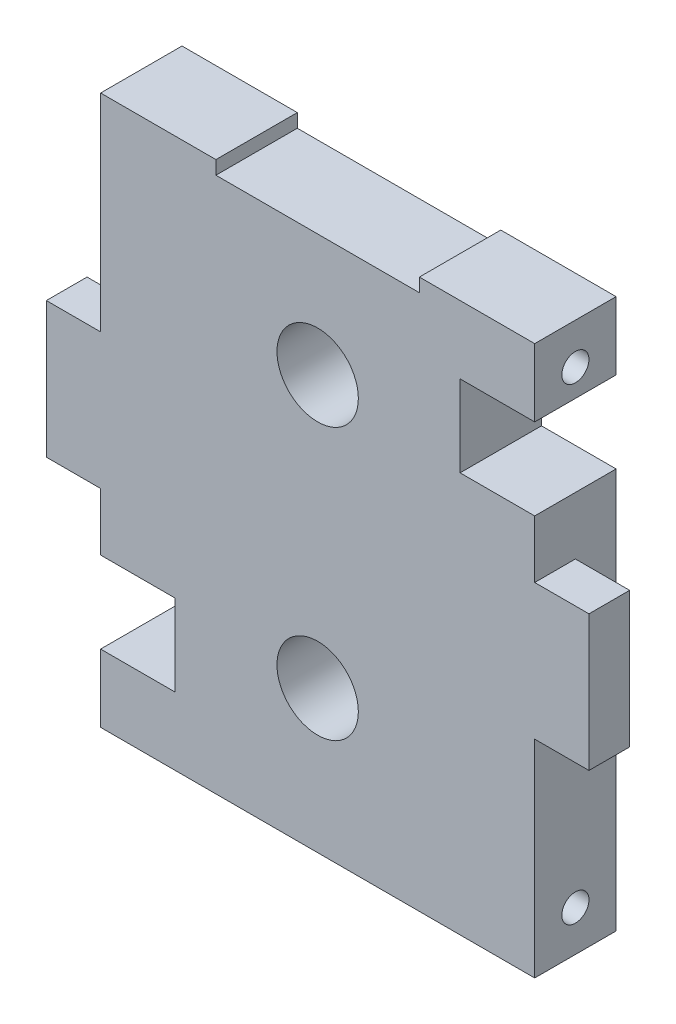
ISO-10303-21;
HEADER;
FILE_DESCRIPTION(('STEP AP214'),'2;1');
FILE_NAME('part.step','',(''),(''),'','','');
FILE_SCHEMA(('AUTOMOTIVE_DESIGN { 1 0 10303 214 1 1 1 1 }'));
ENDSEC;
DATA;
#1=APPLICATION_CONTEXT('core data for automotive mechanical design processes');
#2=APPLICATION_PROTOCOL_DEFINITION('international standard','automotive_design',2000,#1);
#3=PRODUCT_CONTEXT('',#1,'mechanical');
#4=PRODUCT('Part','Part','',(#3));
#5=PRODUCT_RELATED_PRODUCT_CATEGORY('part','',(#4));
#6=PRODUCT_DEFINITION_FORMATION('','',#4);
#7=PRODUCT_DEFINITION_CONTEXT('part definition',#1,'design');
#8=PRODUCT_DEFINITION('design','',#6,#7);
#9=PRODUCT_DEFINITION_SHAPE('','',#8);
#10=(LENGTH_UNIT() NAMED_UNIT(*) SI_UNIT(.MILLI.,.METRE.));
#11=(NAMED_UNIT(*) PLANE_ANGLE_UNIT() SI_UNIT($,.RADIAN.));
#12=(NAMED_UNIT(*) SI_UNIT($,.STERADIAN.) SOLID_ANGLE_UNIT());
#13=UNCERTAINTY_MEASURE_WITH_UNIT(LENGTH_MEASURE(1.E-05),#10,'distance_accuracy_value','');
#14=(GEOMETRIC_REPRESENTATION_CONTEXT(3) GLOBAL_UNCERTAINTY_ASSIGNED_CONTEXT((#13)) GLOBAL_UNIT_ASSIGNED_CONTEXT((#10,
#11,#12)) REPRESENTATION_CONTEXT('',''));
#15=CARTESIAN_POINT('',(0.,0.,0.));
#16=DIRECTION('',(0.,0.,1.));
#17=DIRECTION('',(1.,0.,0.));
#18=AXIS2_PLACEMENT_3D('',#15,#16,#17);
#19=CARTESIAN_POINT('',(32.,0.,3.));
#20=DIRECTION('',(0.,-1.,0.));
#21=DIRECTION('',(0.,0.,-1.));
#22=AXIS2_PLACEMENT_3D('',#19,#20,#21);
#23=PLANE('',#22);
#24=DIRECTION('',(-1.,0.,0.));
#25=VECTOR('',#24,1.);
#26=CARTESIAN_POINT('',(32.,0.,-3.));
#27=LINE('',#26,#25);
#28=CARTESIAN_POINT('',(32.,0.,-3.));
#29=VERTEX_POINT('',#28);
#30=CARTESIAN_POINT('',(23.5,0.,-3.));
#31=VERTEX_POINT('',#30);
#32=EDGE_CURVE('E301',#29,#31,#27,.T.);
#33=ORIENTED_EDGE('',*,*,#32,.T.);
#34=DIRECTION('',(0.,0.,1.));
#35=VECTOR('',#34,1.);
#36=CARTESIAN_POINT('',(23.5,0.,-7.));
#37=LINE('',#36,#35);
#38=CARTESIAN_POINT('',(23.5,0.,3.));
#39=VERTEX_POINT('',#38);
#40=EDGE_CURVE('E283',#31,#39,#37,.T.);
#41=ORIENTED_EDGE('',*,*,#40,.T.);
#42=DIRECTION('',(-1.,0.,0.));
#43=VECTOR('',#42,1.);
#44=CARTESIAN_POINT('',(32.,0.,3.));
#45=LINE('',#44,#43);
#46=CARTESIAN_POINT('',(32.,0.,3.));
#47=VERTEX_POINT('',#46);
#48=EDGE_CURVE('E344',#47,#39,#45,.T.);
#49=ORIENTED_EDGE('',*,*,#48,.F.);
#50=DIRECTION('',(0.,0.,-1.));
#51=VECTOR('',#50,1.);
#52=CARTESIAN_POINT('',(32.,0.,3.));
#53=LINE('',#52,#51);
#54=EDGE_CURVE('E177',#47,#29,#53,.T.);
#55=ORIENTED_EDGE('',*,*,#54,.T.);
#56=EDGE_LOOP('',(#33,#41,#49,#55));
#57=FACE_BOUND('',#56,.T.);
#58=ADVANCED_FACE('F41',(#57),#23,.F.);
#59=CARTESIAN_POINT('',(0.,0.,0.));
#60=DIRECTION('',(0.,0.,1.));
#61=DIRECTION('',(1.,0.,0.));
#62=AXIS2_PLACEMENT_3D('',#59,#60,#61);
#63=PLANE('',#62);
#64=DIRECTION('',(1.,0.,0.));
#65=VECTOR('',#64,1.);
#66=CARTESIAN_POINT('',(36.,-25.25,0.));
#67=LINE('',#66,#65);
#68=CARTESIAN_POINT('',(32.,-25.25,0.));
#69=VERTEX_POINT('',#68);
#70=CARTESIAN_POINT('',(36.,-25.25,0.));
#71=VERTEX_POINT('',#70);
#72=EDGE_CURVE('E189',#69,#71,#67,.T.);
#73=ORIENTED_EDGE('',*,*,#72,.F.);
#74=DIRECTION('',(0.,1.,0.));
#75=VECTOR('',#74,1.);
#76=CARTESIAN_POINT('',(32.,0.,0.));
#77=LINE('',#76,#75);
#78=CARTESIAN_POINT('',(32.,-15.25,0.));
#79=VERTEX_POINT('',#78);
#80=EDGE_CURVE('E333',#69,#79,#77,.T.);
#81=ORIENTED_EDGE('',*,*,#80,.T.);
#82=DIRECTION('',(-1.,0.,0.));
#83=VECTOR('',#82,1.);
#84=CARTESIAN_POINT('',(32.,-15.25,0.));
#85=LINE('',#84,#83);
#86=CARTESIAN_POINT('',(36.,-15.25,0.));
#87=VERTEX_POINT('',#86);
#88=EDGE_CURVE('E192',#87,#79,#85,.T.);
#89=ORIENTED_EDGE('',*,*,#88,.F.);
#90=DIRECTION('',(0.,1.,0.));
#91=VECTOR('',#90,1.);
#92=CARTESIAN_POINT('',(36.,-15.25,0.));
#93=LINE('',#92,#91);
#94=EDGE_CURVE('E87',#71,#87,#93,.T.);
#95=ORIENTED_EDGE('',*,*,#94,.F.);
#96=EDGE_LOOP('',(#73,#81,#89,#95));
#97=FACE_BOUND('',#96,.T.);
#98=ADVANCED_FACE('F486',(#97),#63,.F.);
#99=CARTESIAN_POINT('',(0.,0.,3.));
#100=DIRECTION('',(0.,0.,1.));
#101=DIRECTION('',(1.,0.,0.));
#102=AXIS2_PLACEMENT_3D('',#99,#100,#101);
#103=PLANE('',#102);
#104=DIRECTION('',(0.,1.,0.));
#105=VECTOR('',#104,1.);
#106=CARTESIAN_POINT('',(23.5,-1.,3.));
#107=LINE('',#106,#105);
#108=CARTESIAN_POINT('',(23.5,-1.,3.));
#109=VERTEX_POINT('',#108);
#110=EDGE_CURVE('E793',#109,#39,#107,.T.);
#111=ORIENTED_EDGE('',*,*,#110,.F.);
#112=DIRECTION('',(1.,0.,0.));
#113=VECTOR('',#112,1.);
#114=CARTESIAN_POINT('',(8.5,-1.,3.));
#115=LINE('',#114,#113);
#116=CARTESIAN_POINT('',(8.5,-1.,3.));
#117=VERTEX_POINT('',#116);
#118=EDGE_CURVE('E268',#117,#109,#115,.T.);
#119=ORIENTED_EDGE('',*,*,#118,.F.);
#120=DIRECTION('',(0.,-1.,0.));
#121=VECTOR('',#120,1.);
#122=CARTESIAN_POINT('',(8.5,-1.,3.));
#123=LINE('',#122,#121);
#124=CARTESIAN_POINT('',(8.5,0.,3.));
#125=VERTEX_POINT('',#124);
#126=EDGE_CURVE('E790',#125,#117,#123,.T.);
#127=ORIENTED_EDGE('',*,*,#126,.F.);
#128=CARTESIAN_POINT('',(0.,0.,3.));
#129=VERTEX_POINT('',#128);
#130=EDGE_CURVE('E95',#125,#129,#45,.T.);
#131=ORIENTED_EDGE('',*,*,#130,.T.);
#132=DIRECTION('',(0.,-1.,0.));
#133=VECTOR('',#132,1.);
#134=CARTESIAN_POINT('',(0.,0.,3.));
#135=LINE('',#134,#133);
#136=CARTESIAN_POINT('',(0.,-15.25,3.));
#137=VERTEX_POINT('',#136);
#138=EDGE_CURVE('E346',#129,#137,#135,.T.);
#139=ORIENTED_EDGE('',*,*,#138,.T.);
#140=DIRECTION('',(-1.,0.,0.));
#141=VECTOR('',#140,1.);
#142=CARTESIAN_POINT('',(0.,-15.25,3.));
#143=LINE('',#142,#141);
#144=CARTESIAN_POINT('',(-4.,-15.25,3.));
#145=VERTEX_POINT('',#144);
#146=EDGE_CURVE('E348',#137,#145,#143,.T.);
#147=ORIENTED_EDGE('',*,*,#146,.T.);
#148=DIRECTION('',(0.,-1.,0.));
#149=VECTOR('',#148,1.);
#150=CARTESIAN_POINT('',(-4.,-15.25,3.));
#151=LINE('',#150,#149);
#152=CARTESIAN_POINT('',(-4.,-25.25,3.));
#153=VERTEX_POINT('',#152);
#154=EDGE_CURVE('E350',#145,#153,#151,.T.);
#155=ORIENTED_EDGE('',*,*,#154,.T.);
#156=DIRECTION('',(1.,0.,0.));
#157=VECTOR('',#156,1.);
#158=CARTESIAN_POINT('',(-4.,-25.25,3.));
#159=LINE('',#158,#157);
#160=CARTESIAN_POINT('',(0.,-25.25,3.));
#161=VERTEX_POINT('',#160);
#162=EDGE_CURVE('E352',#153,#161,#159,.T.);
#163=ORIENTED_EDGE('',*,*,#162,.T.);
#164=DIRECTION('',(0.,-1.,0.));
#165=VECTOR('',#164,1.);
#166=CARTESIAN_POINT('',(0.,-25.25,3.));
#167=LINE('',#166,#165);
#168=CARTESIAN_POINT('',(0.,-29.5,3.));
#169=VERTEX_POINT('',#168);
#170=EDGE_CURVE('E354',#161,#169,#167,.T.);
#171=ORIENTED_EDGE('',*,*,#170,.T.);
#172=DIRECTION('',(1.,0.,0.));
#173=VECTOR('',#172,1.);
#174=CARTESIAN_POINT('',(0.,-29.5,3.));
#175=LINE('',#174,#173);
#176=CARTESIAN_POINT('',(5.5,-29.5,3.));
#177=VERTEX_POINT('',#176);
#178=EDGE_CURVE('E356',#169,#177,#175,.T.);
#179=ORIENTED_EDGE('',*,*,#178,.T.);
#180=DIRECTION('',(0.,-1.,0.));
#181=VECTOR('',#180,1.);
#182=CARTESIAN_POINT('',(5.5,-29.5,3.));
#183=LINE('',#182,#181);
#184=CARTESIAN_POINT('',(5.5,-35.5,3.));
#185=VERTEX_POINT('',#184);
#186=EDGE_CURVE('E358',#177,#185,#183,.T.);
#187=ORIENTED_EDGE('',*,*,#186,.T.);
#188=DIRECTION('',(-1.,0.,0.));
#189=VECTOR('',#188,1.);
#190=CARTESIAN_POINT('',(5.5,-35.5,3.));
#191=LINE('',#190,#189);
#192=CARTESIAN_POINT('',(0.,-35.5,3.));
#193=VERTEX_POINT('',#192);
#194=EDGE_CURVE('E360',#185,#193,#191,.T.);
#195=ORIENTED_EDGE('',*,*,#194,.T.);
#196=DIRECTION('',(0.,-1.,0.));
#197=VECTOR('',#196,1.);
#198=CARTESIAN_POINT('',(0.,-35.5,3.));
#199=LINE('',#198,#197);
#200=CARTESIAN_POINT('',(0.,-40.5,3.));
#201=VERTEX_POINT('',#200);
#202=EDGE_CURVE('E362',#193,#201,#199,.T.);
#203=ORIENTED_EDGE('',*,*,#202,.T.);
#204=DIRECTION('',(1.,0.,0.));
#205=VECTOR('',#204,1.);
#206=CARTESIAN_POINT('',(0.,-40.5,3.));
#207=LINE('',#206,#205);
#208=CARTESIAN_POINT('',(32.,-40.5,3.));
#209=VERTEX_POINT('',#208);
#210=EDGE_CURVE('E364',#201,#209,#207,.T.);
#211=ORIENTED_EDGE('',*,*,#210,.T.);
#212=DIRECTION('',(0.,1.,0.));
#213=VECTOR('',#212,1.);
#214=CARTESIAN_POINT('',(32.,-25.25,3.));
#215=LINE('',#214,#213);
#216=CARTESIAN_POINT('',(32.,-25.25,3.));
#217=VERTEX_POINT('',#216);
#218=EDGE_CURVE('E366',#209,#217,#215,.T.);
#219=ORIENTED_EDGE('',*,*,#218,.T.);
#220=DIRECTION('',(1.,0.,0.));
#221=VECTOR('',#220,1.);
#222=CARTESIAN_POINT('',(36.,-25.25,3.));
#223=LINE('',#222,#221);
#224=CARTESIAN_POINT('',(36.,-25.25,3.));
#225=VERTEX_POINT('',#224);
#226=EDGE_CURVE('E368',#217,#225,#223,.T.);
#227=ORIENTED_EDGE('',*,*,#226,.T.);
#228=DIRECTION('',(0.,1.,0.));
#229=VECTOR('',#228,1.);
#230=CARTESIAN_POINT('',(36.,-15.25,3.));
#231=LINE('',#230,#229);
#232=CARTESIAN_POINT('',(36.,-15.25,3.));
#233=VERTEX_POINT('',#232);
#234=EDGE_CURVE('E370',#225,#233,#231,.T.);
#235=ORIENTED_EDGE('',*,*,#234,.T.);
#236=DIRECTION('',(-1.,0.,0.));
#237=VECTOR('',#236,1.);
#238=CARTESIAN_POINT('',(32.,-15.25,3.));
#239=LINE('',#238,#237);
#240=CARTESIAN_POINT('',(32.,-15.25,3.));
#241=VERTEX_POINT('',#240);
#242=EDGE_CURVE('E372',#233,#241,#239,.T.);
#243=ORIENTED_EDGE('',*,*,#242,.T.);
#244=DIRECTION('',(0.,1.,0.));
#245=VECTOR('',#244,1.);
#246=CARTESIAN_POINT('',(32.,-11.,3.));
#247=LINE('',#246,#245);
#248=CARTESIAN_POINT('',(32.,-11.,3.));
#249=VERTEX_POINT('',#248);
#250=EDGE_CURVE('E374',#241,#249,#247,.T.);
#251=ORIENTED_EDGE('',*,*,#250,.T.);
#252=DIRECTION('',(-1.,0.,0.));
#253=VECTOR('',#252,1.);
#254=CARTESIAN_POINT('',(26.5,-11.,3.));
#255=LINE('',#254,#253);
#256=CARTESIAN_POINT('',(26.5,-11.,3.));
#257=VERTEX_POINT('',#256);
#258=EDGE_CURVE('E156',#249,#257,#255,.T.);
#259=ORIENTED_EDGE('',*,*,#258,.T.);
#260=DIRECTION('',(0.,1.,0.));
#261=VECTOR('',#260,1.);
#262=CARTESIAN_POINT('',(26.5,-5.,3.));
#263=LINE('',#262,#261);
#264=CARTESIAN_POINT('',(26.5,-5.,3.));
#265=VERTEX_POINT('',#264);
#266=EDGE_CURVE('E147',#257,#265,#263,.T.);
#267=ORIENTED_EDGE('',*,*,#266,.T.);
#268=DIRECTION('',(1.,0.,0.));
#269=VECTOR('',#268,1.);
#270=CARTESIAN_POINT('',(32.,-5.,3.));
#271=LINE('',#270,#269);
#272=CARTESIAN_POINT('',(32.,-5.,3.));
#273=VERTEX_POINT('',#272);
#274=EDGE_CURVE('E153',#265,#273,#271,.T.);
#275=ORIENTED_EDGE('',*,*,#274,.T.);
#276=DIRECTION('',(0.,1.,0.));
#277=VECTOR('',#276,1.);
#278=CARTESIAN_POINT('',(32.,0.,3.));
#279=LINE('',#278,#277);
#280=EDGE_CURVE('E65',#273,#47,#279,.T.);
#281=ORIENTED_EDGE('',*,*,#280,.T.);
#282=ORIENTED_EDGE('',*,*,#48,.T.);
#283=EDGE_LOOP('',(#111,#119,#127,#131,#139,#147,#155,#163,#171,#179,#187,#195,#203,#211,#219,
#227,#235,#243,#251,#259,#267,#275,#281,#282));
#284=FACE_BOUND('',#283,.T.);
#285=CARTESIAN_POINT('',(16.,-10.,3.));
#286=DIRECTION('',(0.,0.,1.));
#287=DIRECTION('',(1.,0.,0.));
#288=AXIS2_PLACEMENT_3D('',#285,#286,#287);
#289=CIRCLE('',#288,3.);
#290=CARTESIAN_POINT('',(19.,-10.,3.));
#291=VERTEX_POINT('',#290);
#292=EDGE_CURVE('E184',#291,#291,#289,.T.);
#293=ORIENTED_EDGE('',*,*,#292,.F.);
#294=EDGE_LOOP('',(#293));
#295=FACE_BOUND('',#294,.T.);
#296=CARTESIAN_POINT('',(16.,-30.,3.));
#297=DIRECTION('',(0.,0.,1.));
#298=DIRECTION('',(1.,0.,0.));
#299=AXIS2_PLACEMENT_3D('',#296,#297,#298);
#300=CIRCLE('',#299,3.);
#301=CARTESIAN_POINT('',(19.,-30.,3.));
#302=VERTEX_POINT('',#301);
#303=EDGE_CURVE('E339',#302,#302,#300,.T.);
#304=ORIENTED_EDGE('',*,*,#303,.F.);
#305=EDGE_LOOP('',(#304));
#306=FACE_BOUND('',#305,.T.);
#307=ADVANCED_FACE('F150',(#284,#295,#306),#103,.T.);
#308=DIRECTION('',(-1.,0.,0.));
#309=VECTOR('',#308,1.);
#310=CARTESIAN_POINT('',(0.,-15.25,0.));
#311=LINE('',#310,#309);
#312=CARTESIAN_POINT('',(0.,-15.25,0.));
#313=VERTEX_POINT('',#312);
#314=CARTESIAN_POINT('',(-4.,-15.25,0.));
#315=VERTEX_POINT('',#314);
#316=EDGE_CURVE('E181',#313,#315,#311,.T.);
#317=ORIENTED_EDGE('',*,*,#316,.F.);
#318=DIRECTION('',(0.,-1.,0.));
#319=VECTOR('',#318,1.);
#320=CARTESIAN_POINT('',(0.,0.,0.));
#321=LINE('',#320,#319);
#322=CARTESIAN_POINT('',(0.,-25.25,0.));
#323=VERTEX_POINT('',#322);
#324=EDGE_CURVE('E336',#313,#323,#321,.T.);
#325=ORIENTED_EDGE('',*,*,#324,.T.);
#326=DIRECTION('',(1.,0.,0.));
#327=VECTOR('',#326,1.);
#328=CARTESIAN_POINT('',(-4.,-25.25,0.));
#329=LINE('',#328,#327);
#330=CARTESIAN_POINT('',(-4.,-25.25,0.));
#331=VERTEX_POINT('',#330);
#332=EDGE_CURVE('E186',#331,#323,#329,.T.);
#333=ORIENTED_EDGE('',*,*,#332,.F.);
#334=DIRECTION('',(0.,-1.,0.));
#335=VECTOR('',#334,1.);
#336=CARTESIAN_POINT('',(-4.,-15.25,0.));
#337=LINE('',#336,#335);
#338=EDGE_CURVE('E183',#315,#331,#337,.T.);
#339=ORIENTED_EDGE('',*,*,#338,.F.);
#340=EDGE_LOOP('',(#317,#325,#333,#339));
#341=FACE_BOUND('',#340,.T.);
#342=ADVANCED_FACE('F415',(#341),#63,.F.);
#343=ORIENTED_EDGE('',*,*,#130,.F.);
#344=DIRECTION('',(0.,0.,1.));
#345=VECTOR('',#344,1.);
#346=CARTESIAN_POINT('',(8.5,0.,-7.));
#347=LINE('',#346,#345);
#348=CARTESIAN_POINT('',(8.5,0.,-3.));
#349=VERTEX_POINT('',#348);
#350=EDGE_CURVE('E276',#349,#125,#347,.T.);
#351=ORIENTED_EDGE('',*,*,#350,.F.);
#352=CARTESIAN_POINT('',(0.,0.,-3.));
#353=VERTEX_POINT('',#352);
#354=EDGE_CURVE('E300',#349,#353,#27,.T.);
#355=ORIENTED_EDGE('',*,*,#354,.T.);
#356=DIRECTION('',(0.,0.,-1.));
#357=VECTOR('',#356,1.);
#358=CARTESIAN_POINT('',(0.,0.,3.));
#359=LINE('',#358,#357);
#360=EDGE_CURVE('E242',#129,#353,#359,.T.);
#361=ORIENTED_EDGE('',*,*,#360,.F.);
#362=EDGE_LOOP('',(#343,#351,#355,#361));
#363=FACE_BOUND('',#362,.T.);
#364=ADVANCED_FACE('F43',(#363),#23,.F.);
#365=CARTESIAN_POINT('',(0.,-15.25,3.));
#366=DIRECTION('',(0.,-1.,0.));
#367=DIRECTION('',(0.,0.,-1.));
#368=AXIS2_PLACEMENT_3D('',#365,#366,#367);
#369=PLANE('',#368);
#370=ORIENTED_EDGE('',*,*,#316,.T.);
#371=DIRECTION('',(0.,0.,-1.));
#372=VECTOR('',#371,1.);
#373=CARTESIAN_POINT('',(-4.,-15.25,3.));
#374=LINE('',#373,#372);
#375=EDGE_CURVE('E236',#145,#315,#374,.T.);
#376=ORIENTED_EDGE('',*,*,#375,.F.);
#377=ORIENTED_EDGE('',*,*,#146,.F.);
#378=DIRECTION('',(0.,0.,-1.));
#379=VECTOR('',#378,1.);
#380=CARTESIAN_POINT('',(0.,-15.25,3.));
#381=LINE('',#380,#379);
#382=EDGE_CURVE('E239',#137,#313,#381,.T.);
#383=ORIENTED_EDGE('',*,*,#382,.T.);
#384=EDGE_LOOP('',(#370,#376,#377,#383));
#385=FACE_BOUND('',#384,.T.);
#386=ADVANCED_FACE('F412',(#385),#369,.F.);
#387=CARTESIAN_POINT('',(-4.,-15.25,3.));
#388=DIRECTION('',(1.,0.,0.));
#389=DIRECTION('',(0.,1.,0.));
#390=AXIS2_PLACEMENT_3D('',#387,#388,#389);
#391=PLANE('',#390);
#392=ORIENTED_EDGE('',*,*,#338,.T.);
#393=DIRECTION('',(0.,0.,-1.));
#394=VECTOR('',#393,1.);
#395=CARTESIAN_POINT('',(-4.,-25.25,3.));
#396=LINE('',#395,#394);
#397=EDGE_CURVE('E233',#153,#331,#396,.T.);
#398=ORIENTED_EDGE('',*,*,#397,.F.);
#399=ORIENTED_EDGE('',*,*,#154,.F.);
#400=ORIENTED_EDGE('',*,*,#375,.T.);
#401=EDGE_LOOP('',(#392,#398,#399,#400));
#402=FACE_BOUND('',#401,.T.);
#403=ADVANCED_FACE('F418',(#402),#391,.F.);
#404=CARTESIAN_POINT('',(-4.,-25.25,3.));
#405=DIRECTION('',(0.,1.,0.));
#406=DIRECTION('',(0.,0.,1.));
#407=AXIS2_PLACEMENT_3D('',#404,#405,#406);
#408=PLANE('',#407);
#409=ORIENTED_EDGE('',*,*,#332,.T.);
#410=DIRECTION('',(0.,0.,-1.));
#411=VECTOR('',#410,1.);
#412=CARTESIAN_POINT('',(0.,-25.25,3.));
#413=LINE('',#412,#411);
#414=EDGE_CURVE('E230',#161,#323,#413,.T.);
#415=ORIENTED_EDGE('',*,*,#414,.F.);
#416=ORIENTED_EDGE('',*,*,#162,.F.);
#417=ORIENTED_EDGE('',*,*,#397,.T.);
#418=EDGE_LOOP('',(#409,#415,#416,#417));
#419=FACE_BOUND('',#418,.T.);
#420=ADVANCED_FACE('F422',(#419),#408,.F.);
#421=CARTESIAN_POINT('',(0.,-25.25,3.));
#422=DIRECTION('',(1.,0.,0.));
#423=DIRECTION('',(0.,1.,0.));
#424=AXIS2_PLACEMENT_3D('',#421,#422,#423);
#425=PLANE('',#424);
#426=CARTESIAN_POINT('',(-1.48318857196017E-13,-3.,0.));
#427=DIRECTION('',(1.,0.,0.));
#428=DIRECTION('',(0.,1.,0.));
#429=AXIS2_PLACEMENT_3D('',#426,#427,#428);
#430=CIRCLE('',#429,1.);
#431=CARTESIAN_POINT('',(-1.54066948906419E-13,-2.,0.));
#432=VERTEX_POINT('',#431);
#433=EDGE_CURVE('E287',#432,#432,#430,.T.);
#434=ORIENTED_EDGE('',*,*,#433,.T.);
#435=EDGE_LOOP('',(#434));
#436=FACE_BOUND('',#435,.T.);
#437=ORIENTED_EDGE('',*,*,#414,.T.);
#438=ORIENTED_EDGE('',*,*,#324,.F.);
#439=ORIENTED_EDGE('',*,*,#382,.F.);
#440=ORIENTED_EDGE('',*,*,#138,.F.);
#441=ORIENTED_EDGE('',*,*,#360,.T.);
#442=DIRECTION('',(0.,-1.,0.));
#443=VECTOR('',#442,1.);
#444=CARTESIAN_POINT('',(0.,0.,-3.));
#445=LINE('',#444,#443);
#446=CARTESIAN_POINT('',(0.,-29.5,-3.));
#447=VERTEX_POINT('',#446);
#448=EDGE_CURVE('E303',#353,#447,#445,.T.);
#449=ORIENTED_EDGE('',*,*,#448,.T.);
#450=DIRECTION('',(0.,0.,-1.));
#451=VECTOR('',#450,1.);
#452=CARTESIAN_POINT('',(0.,-29.5,3.));
#453=LINE('',#452,#451);
#454=EDGE_CURVE('E227',#169,#447,#453,.T.);
#455=ORIENTED_EDGE('',*,*,#454,.F.);
#456=ORIENTED_EDGE('',*,*,#170,.F.);
#457=EDGE_LOOP('',(#437,#438,#439,#440,#441,#449,#455,#456));
#458=FACE_BOUND('',#457,.T.);
#459=ADVANCED_FACE('F407',(#436,#458),#425,.F.);
#460=CARTESIAN_POINT('',(0.,-29.5,3.));
#461=DIRECTION('',(0.,1.,0.));
#462=DIRECTION('',(0.,0.,1.));
#463=AXIS2_PLACEMENT_3D('',#460,#461,#462);
#464=PLANE('',#463);
#465=ORIENTED_EDGE('',*,*,#454,.T.);
#466=DIRECTION('',(1.,0.,0.));
#467=VECTOR('',#466,1.);
#468=CARTESIAN_POINT('',(0.,-29.5,-3.));
#469=LINE('',#468,#467);
#470=CARTESIAN_POINT('',(5.5,-29.5,-3.));
#471=VERTEX_POINT('',#470);
#472=EDGE_CURVE('E306',#447,#471,#469,.T.);
#473=ORIENTED_EDGE('',*,*,#472,.T.);
#474=DIRECTION('',(0.,0.,-1.));
#475=VECTOR('',#474,1.);
#476=CARTESIAN_POINT('',(5.5,-29.5,3.));
#477=LINE('',#476,#475);
#478=EDGE_CURVE('E224',#177,#471,#477,.T.);
#479=ORIENTED_EDGE('',*,*,#478,.F.);
#480=ORIENTED_EDGE('',*,*,#178,.F.);
#481=EDGE_LOOP('',(#465,#473,#479,#480));
#482=FACE_BOUND('',#481,.T.);
#483=ADVANCED_FACE('F473',(#482),#464,.F.);
#484=CARTESIAN_POINT('',(5.5,-29.5,3.));
#485=DIRECTION('',(1.,0.,0.));
#486=DIRECTION('',(0.,1.,0.));
#487=AXIS2_PLACEMENT_3D('',#484,#485,#486);
#488=PLANE('',#487);
#489=ORIENTED_EDGE('',*,*,#478,.T.);
#490=DIRECTION('',(0.,-1.,0.));
#491=VECTOR('',#490,1.);
#492=CARTESIAN_POINT('',(5.5,-29.5,-3.));
#493=LINE('',#492,#491);
#494=CARTESIAN_POINT('',(5.5,-35.5,-3.));
#495=VERTEX_POINT('',#494);
#496=EDGE_CURVE('E309',#471,#495,#493,.T.);
#497=ORIENTED_EDGE('',*,*,#496,.T.);
#498=DIRECTION('',(0.,0.,-1.));
#499=VECTOR('',#498,1.);
#500=CARTESIAN_POINT('',(5.5,-35.5,3.));
#501=LINE('',#500,#499);
#502=EDGE_CURVE('E221',#185,#495,#501,.T.);
#503=ORIENTED_EDGE('',*,*,#502,.F.);
#504=ORIENTED_EDGE('',*,*,#186,.F.);
#505=EDGE_LOOP('',(#489,#497,#503,#504));
#506=FACE_BOUND('',#505,.T.);
#507=ADVANCED_FACE('F470',(#506),#488,.F.);
#508=CARTESIAN_POINT('',(5.5,-35.5,3.));
#509=DIRECTION('',(0.,-1.,0.));
#510=DIRECTION('',(0.,0.,-1.));
#511=AXIS2_PLACEMENT_3D('',#508,#509,#510);
#512=PLANE('',#511);
#513=ORIENTED_EDGE('',*,*,#502,.T.);
#514=DIRECTION('',(-1.,0.,0.));
#515=VECTOR('',#514,1.);
#516=CARTESIAN_POINT('',(5.5,-35.5,-3.));
#517=LINE('',#516,#515);
#518=CARTESIAN_POINT('',(0.,-35.5,-3.));
#519=VERTEX_POINT('',#518);
#520=EDGE_CURVE('E312',#495,#519,#517,.T.);
#521=ORIENTED_EDGE('',*,*,#520,.T.);
#522=DIRECTION('',(0.,0.,-1.));
#523=VECTOR('',#522,1.);
#524=CARTESIAN_POINT('',(0.,-35.5,3.));
#525=LINE('',#524,#523);
#526=EDGE_CURVE('E218',#193,#519,#525,.T.);
#527=ORIENTED_EDGE('',*,*,#526,.F.);
#528=ORIENTED_EDGE('',*,*,#194,.F.);
#529=EDGE_LOOP('',(#513,#521,#527,#528));
#530=FACE_BOUND('',#529,.T.);
#531=ADVANCED_FACE('F465',(#530),#512,.F.);
#532=CARTESIAN_POINT('',(0.,-35.5,3.));
#533=DIRECTION('',(1.,0.,0.));
#534=DIRECTION('',(0.,1.,0.));
#535=AXIS2_PLACEMENT_3D('',#532,#533,#534);
#536=PLANE('',#535);
#537=CARTESIAN_POINT('',(0.,-37.5,0.));
#538=DIRECTION('',(1.,0.,0.));
#539=DIRECTION('',(0.,1.,0.));
#540=AXIS2_PLACEMENT_3D('',#537,#538,#539);
#541=CIRCLE('',#540,1.);
#542=CARTESIAN_POINT('',(0.,-36.5,0.));
#543=VERTEX_POINT('',#542);
#544=EDGE_CURVE('E291',#543,#543,#541,.T.);
#545=ORIENTED_EDGE('',*,*,#544,.T.);
#546=EDGE_LOOP('',(#545));
#547=FACE_BOUND('',#546,.T.);
#548=ORIENTED_EDGE('',*,*,#526,.T.);
#549=DIRECTION('',(0.,-1.,0.));
#550=VECTOR('',#549,1.);
#551=CARTESIAN_POINT('',(0.,-35.5,-3.));
#552=LINE('',#551,#550);
#553=CARTESIAN_POINT('',(0.,-40.5,-3.));
#554=VERTEX_POINT('',#553);
#555=EDGE_CURVE('E315',#519,#554,#552,.T.);
#556=ORIENTED_EDGE('',*,*,#555,.T.);
#557=DIRECTION('',(0.,0.,-1.));
#558=VECTOR('',#557,1.);
#559=CARTESIAN_POINT('',(0.,-40.5,3.));
#560=LINE('',#559,#558);
#561=EDGE_CURVE('E215',#201,#554,#560,.T.);
#562=ORIENTED_EDGE('',*,*,#561,.F.);
#563=ORIENTED_EDGE('',*,*,#202,.F.);
#564=EDGE_LOOP('',(#548,#556,#562,#563));
#565=FACE_BOUND('',#564,.T.);
#566=ADVANCED_FACE('F460',(#547,#565),#536,.F.);
#567=CARTESIAN_POINT('',(0.,-40.5,3.));
#568=DIRECTION('',(0.,1.,0.));
#569=DIRECTION('',(-1.,0.,0.));
#570=AXIS2_PLACEMENT_3D('',#567,#568,#569);
#571=PLANE('',#570);
#572=ORIENTED_EDGE('',*,*,#561,.T.);
#573=DIRECTION('',(1.,0.,0.));
#574=VECTOR('',#573,1.);
#575=CARTESIAN_POINT('',(0.,-40.5,-3.));
#576=LINE('',#575,#574);
#577=CARTESIAN_POINT('',(32.,-40.5,-3.));
#578=VERTEX_POINT('',#577);
#579=EDGE_CURVE('E318',#554,#578,#576,.T.);
#580=ORIENTED_EDGE('',*,*,#579,.T.);
#581=DIRECTION('',(0.,0.,-1.));
#582=VECTOR('',#581,1.);
#583=CARTESIAN_POINT('',(32.,-40.5,3.));
#584=LINE('',#583,#582);
#585=EDGE_CURVE('E212',#209,#578,#584,.T.);
#586=ORIENTED_EDGE('',*,*,#585,.F.);
#587=ORIENTED_EDGE('',*,*,#210,.F.);
#588=EDGE_LOOP('',(#572,#580,#586,#587));
#589=FACE_BOUND('',#588,.T.);
#590=ADVANCED_FACE('F456',(#589),#571,.F.);
#591=CARTESIAN_POINT('',(36.,-25.25,3.));
#592=DIRECTION('',(0.,1.,0.));
#593=DIRECTION('',(0.,0.,1.));
#594=AXIS2_PLACEMENT_3D('',#591,#592,#593);
#595=PLANE('',#594);
#596=ORIENTED_EDGE('',*,*,#72,.T.);
#597=DIRECTION('',(0.,0.,-1.));
#598=VECTOR('',#597,1.);
#599=CARTESIAN_POINT('',(36.,-25.25,3.));
#600=LINE('',#599,#598);
#601=EDGE_CURVE('E207',#225,#71,#600,.T.);
#602=ORIENTED_EDGE('',*,*,#601,.F.);
#603=ORIENTED_EDGE('',*,*,#226,.F.);
#604=DIRECTION('',(0.,0.,-1.));
#605=VECTOR('',#604,1.);
#606=CARTESIAN_POINT('',(32.,-25.25,3.));
#607=LINE('',#606,#605);
#608=EDGE_CURVE('E209',#217,#69,#607,.T.);
#609=ORIENTED_EDGE('',*,*,#608,.T.);
#610=EDGE_LOOP('',(#596,#602,#603,#609));
#611=FACE_BOUND('',#610,.T.);
#612=ADVANCED_FACE('F479',(#611),#595,.F.);
#613=CARTESIAN_POINT('',(36.,-15.25,3.));
#614=DIRECTION('',(-1.,0.,0.));
#615=DIRECTION('',(0.,0.,1.));
#616=AXIS2_PLACEMENT_3D('',#613,#614,#615);
#617=PLANE('',#616);
#618=ORIENTED_EDGE('',*,*,#94,.T.);
#619=DIRECTION('',(0.,0.,-1.));
#620=VECTOR('',#619,1.);
#621=CARTESIAN_POINT('',(36.,-15.25,3.));
#622=LINE('',#621,#620);
#623=EDGE_CURVE('E205',#233,#87,#622,.T.);
#624=ORIENTED_EDGE('',*,*,#623,.F.);
#625=ORIENTED_EDGE('',*,*,#234,.F.);
#626=ORIENTED_EDGE('',*,*,#601,.T.);
#627=EDGE_LOOP('',(#618,#624,#625,#626));
#628=FACE_BOUND('',#627,.T.);
#629=ADVANCED_FACE('F481',(#628),#617,.F.);
#630=CARTESIAN_POINT('',(32.,-15.25,3.));
#631=DIRECTION('',(0.,-1.,0.));
#632=DIRECTION('',(1.,0.,0.));
#633=AXIS2_PLACEMENT_3D('',#630,#631,#632);
#634=PLANE('',#633);
#635=ORIENTED_EDGE('',*,*,#88,.T.);
#636=DIRECTION('',(0.,0.,-1.));
#637=VECTOR('',#636,1.);
#638=CARTESIAN_POINT('',(32.,-15.25,3.));
#639=LINE('',#638,#637);
#640=EDGE_CURVE('E202',#241,#79,#639,.T.);
#641=ORIENTED_EDGE('',*,*,#640,.F.);
#642=ORIENTED_EDGE('',*,*,#242,.F.);
#643=ORIENTED_EDGE('',*,*,#623,.T.);
#644=EDGE_LOOP('',(#635,#641,#642,#643));
#645=FACE_BOUND('',#644,.T.);
#646=ADVANCED_FACE('F484',(#645),#634,.F.);
#647=CARTESIAN_POINT('',(32.,-11.,3.));
#648=DIRECTION('',(-1.,0.,0.));
#649=DIRECTION('',(0.,-1.,0.));
#650=AXIS2_PLACEMENT_3D('',#647,#648,#649);
#651=PLANE('',#650);
#652=CARTESIAN_POINT('',(32.,-37.5,0.));
#653=DIRECTION('',(1.,0.,0.));
#654=DIRECTION('',(0.,0.,-1.));
#655=AXIS2_PLACEMENT_3D('',#652,#653,#654);
#656=CIRCLE('',#655,1.);
#657=CARTESIAN_POINT('',(32.,-37.5,-1.00000000000001));
#658=VERTEX_POINT('',#657);
#659=EDGE_CURVE('E271',#658,#658,#656,.T.);
#660=ORIENTED_EDGE('',*,*,#659,.F.);
#661=EDGE_LOOP('',(#660));
#662=FACE_BOUND('',#661,.T.);
#663=ORIENTED_EDGE('',*,*,#640,.T.);
#664=ORIENTED_EDGE('',*,*,#80,.F.);
#665=ORIENTED_EDGE('',*,*,#608,.F.);
#666=ORIENTED_EDGE('',*,*,#218,.F.);
#667=ORIENTED_EDGE('',*,*,#585,.T.);
#668=DIRECTION('',(0.,1.,0.));
#669=VECTOR('',#668,1.);
#670=CARTESIAN_POINT('',(32.,-40.5,-3.));
#671=LINE('',#670,#669);
#672=CARTESIAN_POINT('',(32.,-11.,-3.));
#673=VERTEX_POINT('',#672);
#674=EDGE_CURVE('E321',#578,#673,#671,.T.);
#675=ORIENTED_EDGE('',*,*,#674,.T.);
#676=DIRECTION('',(0.,0.,-1.));
#677=VECTOR('',#676,1.);
#678=CARTESIAN_POINT('',(32.,-11.,3.));
#679=LINE('',#678,#677);
#680=EDGE_CURVE('E199',#249,#673,#679,.T.);
#681=ORIENTED_EDGE('',*,*,#680,.F.);
#682=ORIENTED_EDGE('',*,*,#250,.F.);
#683=EDGE_LOOP('',(#663,#664,#665,#666,#667,#675,#681,#682));
#684=FACE_BOUND('',#683,.T.);
#685=ADVANCED_FACE('F380',(#662,#684),#651,.F.);
#686=CARTESIAN_POINT('',(26.5,-11.,3.));
#687=DIRECTION('',(0.,-1.,0.));
#688=DIRECTION('',(1.,0.,0.));
#689=AXIS2_PLACEMENT_3D('',#686,#687,#688);
#690=PLANE('',#689);
#691=ORIENTED_EDGE('',*,*,#680,.T.);
#692=DIRECTION('',(-1.,0.,0.));
#693=VECTOR('',#692,1.);
#694=CARTESIAN_POINT('',(32.,-11.,-3.));
#695=LINE('',#694,#693);
#696=CARTESIAN_POINT('',(26.5,-11.,-3.));
#697=VERTEX_POINT('',#696);
#698=EDGE_CURVE('E324',#673,#697,#695,.T.);
#699=ORIENTED_EDGE('',*,*,#698,.T.);
#700=DIRECTION('',(0.,0.,-1.));
#701=VECTOR('',#700,1.);
#702=CARTESIAN_POINT('',(26.5,-11.,3.));
#703=LINE('',#702,#701);
#704=EDGE_CURVE('E171',#257,#697,#703,.T.);
#705=ORIENTED_EDGE('',*,*,#704,.F.);
#706=ORIENTED_EDGE('',*,*,#258,.F.);
#707=EDGE_LOOP('',(#691,#699,#705,#706));
#708=FACE_BOUND('',#707,.T.);
#709=ADVANCED_FACE('F385',(#708),#690,.F.);
#710=CARTESIAN_POINT('',(26.5,-5.,3.));
#711=DIRECTION('',(-1.,0.,0.));
#712=DIRECTION('',(0.,0.,1.));
#713=AXIS2_PLACEMENT_3D('',#710,#711,#712);
#714=PLANE('',#713);
#715=ORIENTED_EDGE('',*,*,#704,.T.);
#716=DIRECTION('',(0.,1.,0.));
#717=VECTOR('',#716,1.);
#718=CARTESIAN_POINT('',(26.5,-11.,-3.));
#719=LINE('',#718,#717);
#720=CARTESIAN_POINT('',(26.5,-5.,-3.));
#721=VERTEX_POINT('',#720);
#722=EDGE_CURVE('E167',#697,#721,#719,.T.);
#723=ORIENTED_EDGE('',*,*,#722,.T.);
#724=DIRECTION('',(0.,0.,-1.));
#725=VECTOR('',#724,1.);
#726=CARTESIAN_POINT('',(26.5,-5.,3.));
#727=LINE('',#726,#725);
#728=EDGE_CURVE('E163',#265,#721,#727,.T.);
#729=ORIENTED_EDGE('',*,*,#728,.F.);
#730=ORIENTED_EDGE('',*,*,#266,.F.);
#731=EDGE_LOOP('',(#715,#723,#729,#730));
#732=FACE_BOUND('',#731,.T.);
#733=ADVANCED_FACE('F164',(#732),#714,.F.);
#734=CARTESIAN_POINT('',(32.,-5.,3.));
#735=DIRECTION('',(0.,1.,0.));
#736=DIRECTION('',(-1.,0.,0.));
#737=AXIS2_PLACEMENT_3D('',#734,#735,#736);
#738=PLANE('',#737);
#739=ORIENTED_EDGE('',*,*,#728,.T.);
#740=DIRECTION('',(1.,0.,0.));
#741=VECTOR('',#740,1.);
#742=CARTESIAN_POINT('',(26.5,-5.,-3.));
#743=LINE('',#742,#741);
#744=CARTESIAN_POINT('',(32.,-5.,-3.));
#745=VERTEX_POINT('',#744);
#746=EDGE_CURVE('E328',#721,#745,#743,.T.);
#747=ORIENTED_EDGE('',*,*,#746,.T.);
#748=DIRECTION('',(0.,0.,-1.));
#749=VECTOR('',#748,1.);
#750=CARTESIAN_POINT('',(32.,-5.,3.));
#751=LINE('',#750,#749);
#752=EDGE_CURVE('E172',#273,#745,#751,.T.);
#753=ORIENTED_EDGE('',*,*,#752,.F.);
#754=ORIENTED_EDGE('',*,*,#274,.F.);
#755=EDGE_LOOP('',(#739,#747,#753,#754));
#756=FACE_BOUND('',#755,.T.);
#757=ADVANCED_FACE('F174',(#756),#738,.F.);
#758=CARTESIAN_POINT('',(32.,0.,3.));
#759=DIRECTION('',(-1.,0.,0.));
#760=DIRECTION('',(0.,0.,1.));
#761=AXIS2_PLACEMENT_3D('',#758,#759,#760);
#762=PLANE('',#761);
#763=CARTESIAN_POINT('',(32.,-3.,0.));
#764=DIRECTION('',(1.,0.,0.));
#765=DIRECTION('',(0.,0.,-1.));
#766=AXIS2_PLACEMENT_3D('',#763,#764,#765);
#767=CIRCLE('',#766,1.);
#768=CARTESIAN_POINT('',(32.,-3.,-1.));
#769=VERTEX_POINT('',#768);
#770=EDGE_CURVE('E274',#769,#769,#767,.T.);
#771=ORIENTED_EDGE('',*,*,#770,.F.);
#772=EDGE_LOOP('',(#771));
#773=FACE_BOUND('',#772,.T.);
#774=ORIENTED_EDGE('',*,*,#752,.T.);
#775=DIRECTION('',(0.,1.,0.));
#776=VECTOR('',#775,1.);
#777=CARTESIAN_POINT('',(32.,-5.,-3.));
#778=LINE('',#777,#776);
#779=EDGE_CURVE('E330',#745,#29,#778,.T.);
#780=ORIENTED_EDGE('',*,*,#779,.T.);
#781=ORIENTED_EDGE('',*,*,#54,.F.);
#782=ORIENTED_EDGE('',*,*,#280,.F.);
#783=EDGE_LOOP('',(#774,#780,#781,#782));
#784=FACE_BOUND('',#783,.T.);
#785=ADVANCED_FACE('F539',(#773,#784),#762,.F.);
#786=CARTESIAN_POINT('',(16.,-10.,3.));
#787=DIRECTION('',(0.,0.,-1.));
#788=DIRECTION('',(-1.,0.,0.));
#789=AXIS2_PLACEMENT_3D('',#786,#787,#788);
#790=CYLINDRICAL_SURFACE('',#789,3.);
#791=ORIENTED_EDGE('',*,*,#292,.T.);
#792=EDGE_LOOP('',(#791));
#793=FACE_BOUND('',#792,.T.);
#794=CARTESIAN_POINT('',(16.,-10.,-3.));
#795=DIRECTION('',(0.,0.,1.));
#796=DIRECTION('',(1.,0.,0.));
#797=AXIS2_PLACEMENT_3D('',#794,#795,#796);
#798=CIRCLE('',#797,3.);
#799=CARTESIAN_POINT('',(19.,-10.,-3.));
#800=VERTEX_POINT('',#799);
#801=EDGE_CURVE('E297',#800,#800,#798,.T.);
#802=ORIENTED_EDGE('',*,*,#801,.F.);
#803=EDGE_LOOP('',(#802));
#804=FACE_BOUND('',#803,.T.);
#805=ADVANCED_FACE('F541',(#793,#804),#790,.F.);
#806=CARTESIAN_POINT('',(16.,-30.,3.));
#807=DIRECTION('',(0.,0.,-1.));
#808=DIRECTION('',(-1.,0.,0.));
#809=AXIS2_PLACEMENT_3D('',#806,#807,#808);
#810=CYLINDRICAL_SURFACE('',#809,3.);
#811=ORIENTED_EDGE('',*,*,#303,.T.);
#812=EDGE_LOOP('',(#811));
#813=FACE_BOUND('',#812,.T.);
#814=CARTESIAN_POINT('',(16.,-30.,-3.));
#815=DIRECTION('',(0.,0.,1.));
#816=DIRECTION('',(1.,0.,0.));
#817=AXIS2_PLACEMENT_3D('',#814,#815,#816);
#818=CIRCLE('',#817,3.);
#819=CARTESIAN_POINT('',(19.,-30.,-3.));
#820=VERTEX_POINT('',#819);
#821=EDGE_CURVE('E294',#820,#820,#818,.T.);
#822=ORIENTED_EDGE('',*,*,#821,.F.);
#823=EDGE_LOOP('',(#822));
#824=FACE_BOUND('',#823,.T.);
#825=ADVANCED_FACE('F547',(#813,#824),#810,.F.);
#826=CARTESIAN_POINT('',(0.,0.,-3.));
#827=DIRECTION('',(0.,0.,1.));
#828=DIRECTION('',(1.,0.,0.));
#829=AXIS2_PLACEMENT_3D('',#826,#827,#828);
#830=PLANE('',#829);
#831=ORIENTED_EDGE('',*,*,#821,.T.);
#832=EDGE_LOOP('',(#831));
#833=FACE_BOUND('',#832,.T.);
#834=ORIENTED_EDGE('',*,*,#801,.T.);
#835=EDGE_LOOP('',(#834));
#836=FACE_BOUND('',#835,.T.);
#837=DIRECTION('',(1.,0.,0.));
#838=VECTOR('',#837,1.);
#839=CARTESIAN_POINT('',(0.,-1.,-3.));
#840=LINE('',#839,#838);
#841=CARTESIAN_POINT('',(8.5,-1.,-3.));
#842=VERTEX_POINT('',#841);
#843=CARTESIAN_POINT('',(23.5,-1.,-3.));
#844=VERTEX_POINT('',#843);
#845=EDGE_CURVE('E49',#842,#844,#840,.T.);
#846=ORIENTED_EDGE('',*,*,#845,.T.);
#847=DIRECTION('',(0.,1.,0.));
#848=VECTOR('',#847,1.);
#849=CARTESIAN_POINT('',(23.5,0.,-3.));
#850=LINE('',#849,#848);
#851=EDGE_CURVE('E11',#844,#31,#850,.T.);
#852=ORIENTED_EDGE('',*,*,#851,.T.);
#853=ORIENTED_EDGE('',*,*,#32,.F.);
#854=ORIENTED_EDGE('',*,*,#779,.F.);
#855=ORIENTED_EDGE('',*,*,#746,.F.);
#856=ORIENTED_EDGE('',*,*,#722,.F.);
#857=ORIENTED_EDGE('',*,*,#698,.F.);
#858=ORIENTED_EDGE('',*,*,#674,.F.);
#859=ORIENTED_EDGE('',*,*,#579,.F.);
#860=ORIENTED_EDGE('',*,*,#555,.F.);
#861=ORIENTED_EDGE('',*,*,#520,.F.);
#862=ORIENTED_EDGE('',*,*,#496,.F.);
#863=ORIENTED_EDGE('',*,*,#472,.F.);
#864=ORIENTED_EDGE('',*,*,#448,.F.);
#865=ORIENTED_EDGE('',*,*,#354,.F.);
#866=DIRECTION('',(0.,-1.,0.));
#867=VECTOR('',#866,1.);
#868=CARTESIAN_POINT('',(8.5,0.,-3.));
#869=LINE('',#868,#867);
#870=EDGE_CURVE('E245',#349,#842,#869,.T.);
#871=ORIENTED_EDGE('',*,*,#870,.T.);
#872=EDGE_LOOP('',(#846,#852,#853,#854,#855,#856,#857,#858,#859,#860,#861,#862,#863,#864,#865,#871));
#873=FACE_BOUND('',#872,.T.);
#874=ADVANCED_FACE('F250',(#833,#836,#873),#830,.F.);
#875=CARTESIAN_POINT('',(-4.,-3.,0.));
#876=DIRECTION('',(1.,0.,0.));
#877=DIRECTION('',(0.,0.,-1.));
#878=AXIS2_PLACEMENT_3D('',#875,#876,#877);
#879=CYLINDRICAL_SURFACE('',#878,1.);
#880=ORIENTED_EDGE('',*,*,#770,.T.);
#881=EDGE_LOOP('',(#880));
#882=FACE_BOUND('',#881,.T.);
#883=ORIENTED_EDGE('',*,*,#433,.F.);
#884=EDGE_LOOP('',(#883));
#885=FACE_BOUND('',#884,.T.);
#886=ADVANCED_FACE('F552',(#882,#885),#879,.F.);
#887=CARTESIAN_POINT('',(-4.,-37.5,0.));
#888=DIRECTION('',(1.,0.,0.));
#889=DIRECTION('',(0.,0.,-1.));
#890=AXIS2_PLACEMENT_3D('',#887,#888,#889);
#891=CYLINDRICAL_SURFACE('',#890,1.);
#892=ORIENTED_EDGE('',*,*,#659,.T.);
#893=EDGE_LOOP('',(#892));
#894=FACE_BOUND('',#893,.T.);
#895=ORIENTED_EDGE('',*,*,#544,.F.);
#896=EDGE_LOOP('',(#895));
#897=FACE_BOUND('',#896,.T.);
#898=ADVANCED_FACE('F554',(#894,#897),#891,.F.);
#899=CARTESIAN_POINT('',(23.5,-1.,-7.));
#900=DIRECTION('',(1.,0.,0.));
#901=DIRECTION('',(0.,0.,-1.));
#902=AXIS2_PLACEMENT_3D('',#899,#900,#901);
#903=PLANE('',#902);
#904=DIRECTION('',(0.,0.,1.));
#905=VECTOR('',#904,1.);
#906=CARTESIAN_POINT('',(23.5,-1.,-7.));
#907=LINE('',#906,#905);
#908=EDGE_CURVE('E265',#844,#109,#907,.T.);
#909=ORIENTED_EDGE('',*,*,#908,.T.);
#910=ORIENTED_EDGE('',*,*,#110,.T.);
#911=ORIENTED_EDGE('',*,*,#40,.F.);
#912=ORIENTED_EDGE('',*,*,#851,.F.);
#913=EDGE_LOOP('',(#909,#910,#911,#912));
#914=FACE_BOUND('',#913,.T.);
#915=ADVANCED_FACE('F560',(#914),#903,.F.);
#916=CARTESIAN_POINT('',(8.5,-1.,-7.));
#917=DIRECTION('',(0.,-1.,0.));
#918=DIRECTION('',(0.,0.,-1.));
#919=AXIS2_PLACEMENT_3D('',#916,#917,#918);
#920=PLANE('',#919);
#921=DIRECTION('',(0.,0.,1.));
#922=VECTOR('',#921,1.);
#923=CARTESIAN_POINT('',(8.5,-1.,-7.));
#924=LINE('',#923,#922);
#925=EDGE_CURVE('E56',#842,#117,#924,.T.);
#926=ORIENTED_EDGE('',*,*,#925,.T.);
#927=ORIENTED_EDGE('',*,*,#118,.T.);
#928=ORIENTED_EDGE('',*,*,#908,.F.);
#929=ORIENTED_EDGE('',*,*,#845,.F.);
#930=EDGE_LOOP('',(#926,#927,#928,#929));
#931=FACE_BOUND('',#930,.T.);
#932=ADVANCED_FACE('F261',(#931),#920,.F.);
#933=CARTESIAN_POINT('',(8.5,-1.,-7.));
#934=DIRECTION('',(-1.,0.,0.));
#935=DIRECTION('',(0.,0.,1.));
#936=AXIS2_PLACEMENT_3D('',#933,#934,#935);
#937=PLANE('',#936);
#938=ORIENTED_EDGE('',*,*,#350,.T.);
#939=ORIENTED_EDGE('',*,*,#126,.T.);
#940=ORIENTED_EDGE('',*,*,#925,.F.);
#941=ORIENTED_EDGE('',*,*,#870,.F.);
#942=EDGE_LOOP('',(#938,#939,#940,#941));
#943=FACE_BOUND('',#942,.T.);
#944=ADVANCED_FACE('F780',(#943),#937,.F.);
#945=CLOSED_SHELL('',(#58,#98,#307,#342,#364,#386,#403,#420,#459,#483,#507,#531,#566,#590,#612,
#629,#646,#685,#709,#733,#757,#785,#805,#825,#874,#886,#898,#915,#932,#944));
#946=MANIFOLD_SOLID_BREP('B2',#945);
#947=ADVANCED_BREP_SHAPE_REPRESENTATION('',(#18,#946),#14);
#948=SHAPE_DEFINITION_REPRESENTATION(#9,#947);
ENDSEC;
END-ISO-10303-21;
